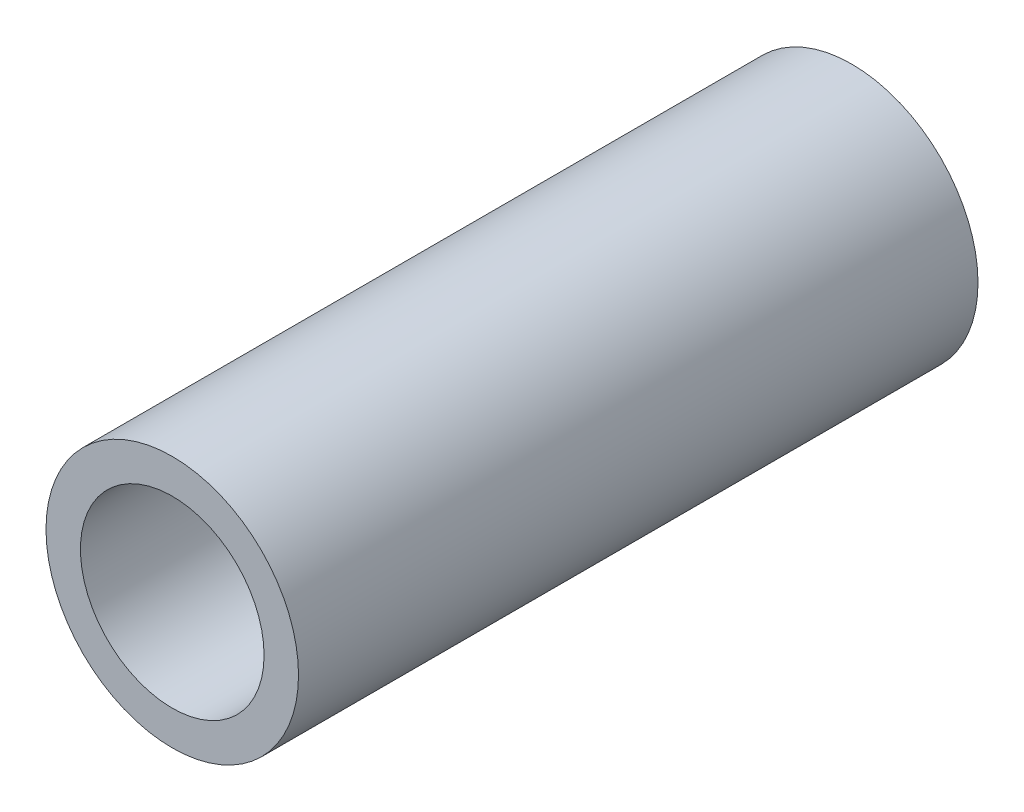
ISO-10303-21;
HEADER;
FILE_DESCRIPTION(('STEP AP214'),'2;1');
FILE_NAME('part.step','',(''),(''),'','','');
FILE_SCHEMA(('AUTOMOTIVE_DESIGN { 1 0 10303 214 1 1 1 1 }'));
ENDSEC;
DATA;
#1=APPLICATION_CONTEXT('core data for automotive mechanical design processes');
#2=APPLICATION_PROTOCOL_DEFINITION('international standard','automotive_design',2000,#1);
#3=PRODUCT_CONTEXT('',#1,'mechanical');
#4=PRODUCT('Part','Part','',(#3));
#5=PRODUCT_RELATED_PRODUCT_CATEGORY('part','',(#4));
#6=PRODUCT_DEFINITION_FORMATION('','',#4);
#7=PRODUCT_DEFINITION_CONTEXT('part definition',#1,'design');
#8=PRODUCT_DEFINITION('design','',#6,#7);
#9=PRODUCT_DEFINITION_SHAPE('','',#8);
#10=(LENGTH_UNIT() NAMED_UNIT(*) SI_UNIT(.MILLI.,.METRE.));
#11=(NAMED_UNIT(*) PLANE_ANGLE_UNIT() SI_UNIT($,.RADIAN.));
#12=(NAMED_UNIT(*) SI_UNIT($,.STERADIAN.) SOLID_ANGLE_UNIT());
#13=UNCERTAINTY_MEASURE_WITH_UNIT(LENGTH_MEASURE(1.E-05),#10,'distance_accuracy_value','');
#14=(GEOMETRIC_REPRESENTATION_CONTEXT(3) GLOBAL_UNCERTAINTY_ASSIGNED_CONTEXT((#13)) GLOBAL_UNIT_ASSIGNED_CONTEXT((#10,
#11,#12)) REPRESENTATION_CONTEXT('',''));
#15=CARTESIAN_POINT('',(0.,0.,0.));
#16=DIRECTION('',(0.,0.,1.));
#17=DIRECTION('',(1.,0.,0.));
#18=AXIS2_PLACEMENT_3D('',#15,#16,#17);
#19=CARTESIAN_POINT('',(0.,0.,-14.8));
#20=DIRECTION('',(0.,0.,1.));
#21=DIRECTION('',(1.,0.,0.));
#22=AXIS2_PLACEMENT_3D('',#19,#20,#21);
#23=CYLINDRICAL_SURFACE('',#22,2.75);
#24=CARTESIAN_POINT('',(0.,0.,-14.8));
#25=DIRECTION('',(0.,0.,1.));
#26=DIRECTION('',(1.,0.,0.));
#27=AXIS2_PLACEMENT_3D('',#24,#25,#26);
#28=CIRCLE('',#27,2.75);
#29=CARTESIAN_POINT('',(2.75,0.,-14.8));
#30=VERTEX_POINT('',#29);
#31=EDGE_CURVE('E10',#30,#30,#28,.T.);
#32=ORIENTED_EDGE('',*,*,#31,.T.);
#33=EDGE_LOOP('',(#32));
#34=FACE_BOUND('',#33,.T.);
#35=CARTESIAN_POINT('',(0.,0.,0.));
#36=DIRECTION('',(0.,0.,1.));
#37=DIRECTION('',(1.,0.,0.));
#38=AXIS2_PLACEMENT_3D('',#35,#36,#37);
#39=CIRCLE('',#38,2.75);
#40=CARTESIAN_POINT('',(2.75,0.,0.));
#41=VERTEX_POINT('',#40);
#42=EDGE_CURVE('E35',#41,#41,#39,.T.);
#43=ORIENTED_EDGE('',*,*,#42,.F.);
#44=EDGE_LOOP('',(#43));
#45=FACE_BOUND('',#44,.T.);
#46=ADVANCED_FACE('F32',(#34,#45),#23,.T.);
#47=CARTESIAN_POINT('',(0.,0.,-14.8));
#48=DIRECTION('',(0.,0.,1.));
#49=DIRECTION('',(1.,0.,0.));
#50=AXIS2_PLACEMENT_3D('',#47,#48,#49);
#51=PLANE('',#50);
#52=CARTESIAN_POINT('',(0.,0.,-14.8));
#53=DIRECTION('',(0.,0.,1.));
#54=DIRECTION('',(1.,0.,0.));
#55=AXIS2_PLACEMENT_3D('',#52,#53,#54);
#56=CIRCLE('',#55,2.);
#57=CARTESIAN_POINT('',(2.,0.,-14.8));
#58=VERTEX_POINT('',#57);
#59=EDGE_CURVE('E42',#58,#58,#56,.T.);
#60=ORIENTED_EDGE('',*,*,#59,.T.);
#61=EDGE_LOOP('',(#60));
#62=FACE_BOUND('',#61,.T.);
#63=ORIENTED_EDGE('',*,*,#31,.F.);
#64=EDGE_LOOP('',(#63));
#65=FACE_BOUND('',#64,.T.);
#66=ADVANCED_FACE('F50',(#62,#65),#51,.F.);
#67=CARTESIAN_POINT('',(0.,0.,0.));
#68=DIRECTION('',(0.,0.,1.));
#69=DIRECTION('',(1.,0.,0.));
#70=AXIS2_PLACEMENT_3D('',#67,#68,#69);
#71=PLANE('',#70);
#72=CARTESIAN_POINT('',(0.,0.,0.));
#73=DIRECTION('',(0.,0.,1.));
#74=DIRECTION('',(1.,0.,0.));
#75=AXIS2_PLACEMENT_3D('',#72,#73,#74);
#76=CIRCLE('',#75,2.);
#77=CARTESIAN_POINT('',(2.,0.,0.));
#78=VERTEX_POINT('',#77);
#79=EDGE_CURVE('E44',#78,#78,#76,.T.);
#80=ORIENTED_EDGE('',*,*,#79,.F.);
#81=EDGE_LOOP('',(#80));
#82=FACE_BOUND('',#81,.T.);
#83=ORIENTED_EDGE('',*,*,#42,.T.);
#84=EDGE_LOOP('',(#83));
#85=FACE_BOUND('',#84,.T.);
#86=ADVANCED_FACE('F56',(#82,#85),#71,.T.);
#87=CARTESIAN_POINT('',(0.,0.,-14.8));
#88=DIRECTION('',(0.,0.,1.));
#89=DIRECTION('',(1.,0.,0.));
#90=AXIS2_PLACEMENT_3D('',#87,#88,#89);
#91=CYLINDRICAL_SURFACE('',#90,2.);
#92=ORIENTED_EDGE('',*,*,#59,.F.);
#93=EDGE_LOOP('',(#92));
#94=FACE_BOUND('',#93,.T.);
#95=ORIENTED_EDGE('',*,*,#79,.T.);
#96=EDGE_LOOP('',(#95));
#97=FACE_BOUND('',#96,.T.);
#98=ADVANCED_FACE('F53',(#94,#97),#91,.F.);
#99=CLOSED_SHELL('',(#46,#66,#86,#98));
#100=MANIFOLD_SOLID_BREP('B2',#99);
#101=ADVANCED_BREP_SHAPE_REPRESENTATION('',(#18,#100),#14);
#102=SHAPE_DEFINITION_REPRESENTATION(#9,#101);
ENDSEC;
END-ISO-10303-21;
